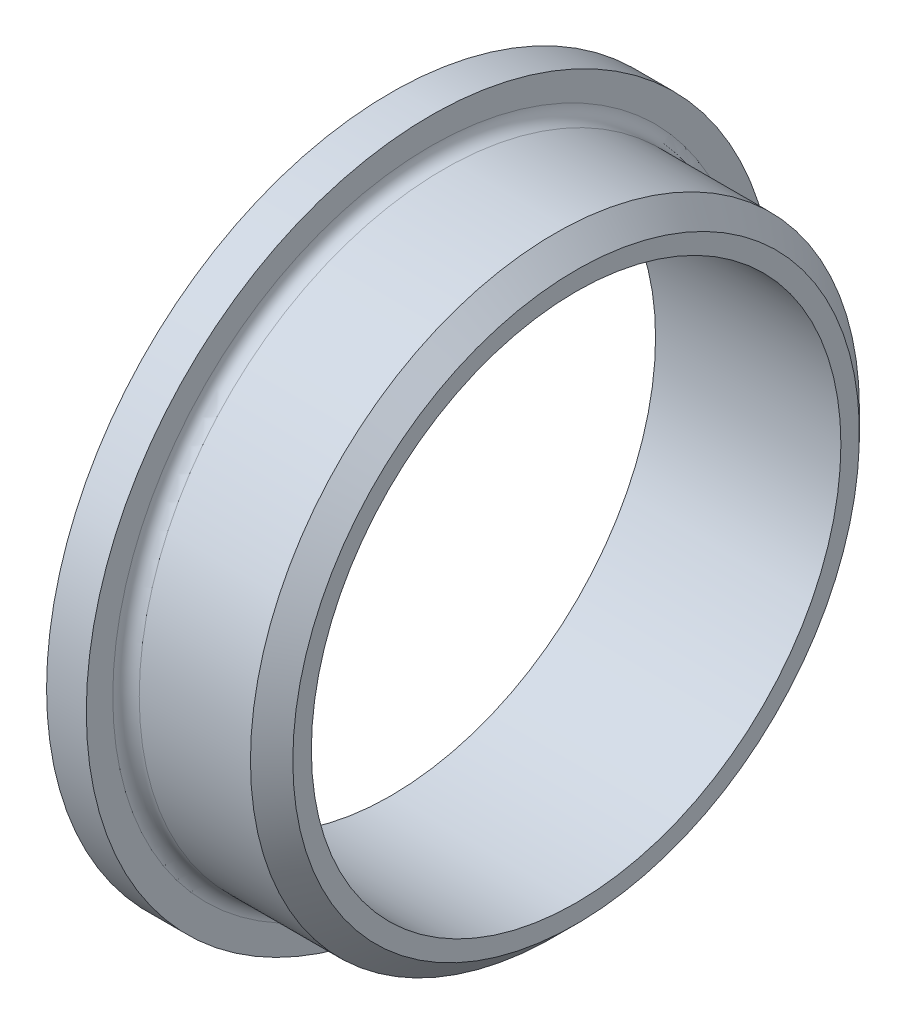
ISO-10303-21;
HEADER;
FILE_DESCRIPTION(('STEP AP214'),'2;1');
FILE_NAME('part.step','',(''),(''),'','','');
FILE_SCHEMA(('AUTOMOTIVE_DESIGN { 1 0 10303 214 1 1 1 1 }'));
ENDSEC;
DATA;
#1=APPLICATION_CONTEXT('core data for automotive mechanical design processes');
#2=APPLICATION_PROTOCOL_DEFINITION('international standard','automotive_design',2000,#1);
#3=PRODUCT_CONTEXT('',#1,'mechanical');
#4=PRODUCT('Part','Part','',(#3));
#5=PRODUCT_RELATED_PRODUCT_CATEGORY('part','',(#4));
#6=PRODUCT_DEFINITION_FORMATION('','',#4);
#7=PRODUCT_DEFINITION_CONTEXT('part definition',#1,'design');
#8=PRODUCT_DEFINITION('design','',#6,#7);
#9=PRODUCT_DEFINITION_SHAPE('','',#8);
#10=(LENGTH_UNIT() NAMED_UNIT(*) SI_UNIT(.MILLI.,.METRE.));
#11=(NAMED_UNIT(*) PLANE_ANGLE_UNIT() SI_UNIT($,.RADIAN.));
#12=(NAMED_UNIT(*) SI_UNIT($,.STERADIAN.) SOLID_ANGLE_UNIT());
#13=UNCERTAINTY_MEASURE_WITH_UNIT(LENGTH_MEASURE(1.E-05),#10,'distance_accuracy_value','');
#14=(GEOMETRIC_REPRESENTATION_CONTEXT(3) GLOBAL_UNCERTAINTY_ASSIGNED_CONTEXT((#13)) GLOBAL_UNIT_ASSIGNED_CONTEXT((#10,
#11,#12)) REPRESENTATION_CONTEXT('',''));
#15=CARTESIAN_POINT('',(0.,0.,0.));
#16=DIRECTION('',(0.,0.,1.));
#17=DIRECTION('',(1.,0.,0.));
#18=AXIS2_PLACEMENT_3D('',#15,#16,#17);
#19=CARTESIAN_POINT('',(7.,11.5,0.));
#20=DIRECTION('',(-1.,0.,0.));
#21=DIRECTION('',(0.,0.,1.));
#22=AXIS2_PLACEMENT_3D('',#19,#20,#21);
#23=PLANE('',#22);
#24=CARTESIAN_POINT('',(7.,0.,0.));
#25=DIRECTION('',(-1.,0.,0.));
#26=DIRECTION('',(0.,0.,1.));
#27=AXIS2_PLACEMENT_3D('',#24,#25,#26);
#28=CIRCLE('',#27,10.7);
#29=CARTESIAN_POINT('',(7.,0.,10.7));
#30=VERTEX_POINT('',#29);
#31=EDGE_CURVE('E10',#30,#30,#28,.F.);
#32=ORIENTED_EDGE('',*,*,#31,.T.);
#33=EDGE_LOOP('',(#32));
#34=FACE_BOUND('',#33,.T.);
#35=CARTESIAN_POINT('',(7.,0.,0.));
#36=DIRECTION('',(-1.,0.,0.));
#37=DIRECTION('',(0.,0.,1.));
#38=AXIS2_PLACEMENT_3D('',#35,#36,#37);
#39=CIRCLE('',#38,10.);
#40=CARTESIAN_POINT('',(7.,0.,10.));
#41=VERTEX_POINT('',#40);
#42=EDGE_CURVE('E70',#41,#41,#39,.T.);
#43=ORIENTED_EDGE('',*,*,#42,.T.);
#44=EDGE_LOOP('',(#43));
#45=FACE_BOUND('',#44,.T.);
#46=ADVANCED_FACE('F45',(#34,#45),#23,.F.);
#47=CARTESIAN_POINT('',(0.,0.,0.));
#48=DIRECTION('',(-1.,0.,0.));
#49=DIRECTION('',(0.,0.,1.));
#50=AXIS2_PLACEMENT_3D('',#47,#48,#49);
#51=CYLINDRICAL_SURFACE('',#50,10.);
#52=ORIENTED_EDGE('',*,*,#42,.F.);
#53=EDGE_LOOP('',(#52));
#54=FACE_BOUND('',#53,.T.);
#55=CARTESIAN_POINT('',(0.,0.,0.));
#56=DIRECTION('',(-1.,0.,0.));
#57=DIRECTION('',(0.,0.,1.));
#58=AXIS2_PLACEMENT_3D('',#55,#56,#57);
#59=CIRCLE('',#58,10.);
#60=CARTESIAN_POINT('',(0.,0.,10.));
#61=VERTEX_POINT('',#60);
#62=EDGE_CURVE('E74',#61,#61,#59,.T.);
#63=ORIENTED_EDGE('',*,*,#62,.T.);
#64=EDGE_LOOP('',(#63));
#65=FACE_BOUND('',#64,.T.);
#66=ADVANCED_FACE('F105',(#54,#65),#51,.F.);
#67=CARTESIAN_POINT('',(0.,10.,0.));
#68=DIRECTION('',(1.,0.,0.));
#69=DIRECTION('',(0.,0.,-1.));
#70=AXIS2_PLACEMENT_3D('',#67,#68,#69);
#71=PLANE('',#70);
#72=ORIENTED_EDGE('',*,*,#62,.F.);
#73=EDGE_LOOP('',(#72));
#74=FACE_BOUND('',#73,.T.);
#75=CARTESIAN_POINT('',(0.,0.,0.));
#76=DIRECTION('',(-1.,0.,0.));
#77=DIRECTION('',(0.,0.,1.));
#78=AXIS2_PLACEMENT_3D('',#75,#76,#77);
#79=CIRCLE('',#78,13.);
#80=CARTESIAN_POINT('',(0.,0.,13.));
#81=VERTEX_POINT('',#80);
#82=EDGE_CURVE('E78',#81,#81,#79,.T.);
#83=ORIENTED_EDGE('',*,*,#82,.T.);
#84=EDGE_LOOP('',(#83));
#85=FACE_BOUND('',#84,.T.);
#86=ADVANCED_FACE('F101',(#74,#85),#71,.F.);
#87=CARTESIAN_POINT('',(0.,0.,0.));
#88=DIRECTION('',(-1.,0.,0.));
#89=DIRECTION('',(0.,0.,1.));
#90=AXIS2_PLACEMENT_3D('',#87,#88,#89);
#91=CYLINDRICAL_SURFACE('',#90,13.);
#92=ORIENTED_EDGE('',*,*,#82,.F.);
#93=EDGE_LOOP('',(#92));
#94=FACE_BOUND('',#93,.T.);
#95=CARTESIAN_POINT('',(1.5,0.,0.));
#96=DIRECTION('',(-1.,0.,0.));
#97=DIRECTION('',(0.,0.,1.));
#98=AXIS2_PLACEMENT_3D('',#95,#96,#97);
#99=CIRCLE('',#98,13.);
#100=CARTESIAN_POINT('',(1.5,0.,13.));
#101=VERTEX_POINT('',#100);
#102=EDGE_CURVE('E82',#101,#101,#99,.T.);
#103=ORIENTED_EDGE('',*,*,#102,.T.);
#104=EDGE_LOOP('',(#103));
#105=FACE_BOUND('',#104,.T.);
#106=ADVANCED_FACE('F87',(#94,#105),#91,.T.);
#107=CARTESIAN_POINT('',(1.5,13.,0.));
#108=DIRECTION('',(-1.,0.,0.));
#109=DIRECTION('',(0.,0.,1.));
#110=AXIS2_PLACEMENT_3D('',#107,#108,#109);
#111=PLANE('',#110);
#112=CARTESIAN_POINT('',(1.5,0.,0.));
#113=DIRECTION('',(-1.,0.,0.));
#114=DIRECTION('',(0.,0.,1.));
#115=AXIS2_PLACEMENT_3D('',#112,#113,#114);
#116=CIRCLE('',#115,12.);
#117=CARTESIAN_POINT('',(1.5,0.,12.));
#118=VERTEX_POINT('',#117);
#119=EDGE_CURVE('E64',#118,#118,#116,.T.);
#120=ORIENTED_EDGE('',*,*,#119,.T.);
#121=EDGE_LOOP('',(#120));
#122=FACE_BOUND('',#121,.T.);
#123=ORIENTED_EDGE('',*,*,#102,.F.);
#124=EDGE_LOOP('',(#123));
#125=FACE_BOUND('',#124,.T.);
#126=ADVANCED_FACE('F89',(#122,#125),#111,.F.);
#127=CARTESIAN_POINT('',(0.,0.,0.));
#128=DIRECTION('',(-1.,0.,0.));
#129=DIRECTION('',(0.,0.,1.));
#130=AXIS2_PLACEMENT_3D('',#127,#128,#129);
#131=CYLINDRICAL_SURFACE('',#130,11.5);
#132=CARTESIAN_POINT('',(6.2,0.,0.));
#133=DIRECTION('',(-1.,0.,0.));
#134=DIRECTION('',(0.,0.,1.));
#135=AXIS2_PLACEMENT_3D('',#132,#133,#134);
#136=CIRCLE('',#135,11.5);
#137=CARTESIAN_POINT('',(6.2,0.,11.5));
#138=VERTEX_POINT('',#137);
#139=EDGE_CURVE('E54',#138,#138,#136,.T.);
#140=ORIENTED_EDGE('',*,*,#139,.T.);
#141=EDGE_LOOP('',(#140));
#142=FACE_BOUND('',#141,.T.);
#143=CARTESIAN_POINT('',(2.,0.,0.));
#144=DIRECTION('',(-1.,0.,0.));
#145=DIRECTION('',(0.,0.,1.));
#146=AXIS2_PLACEMENT_3D('',#143,#144,#145);
#147=CIRCLE('',#146,11.5);
#148=CARTESIAN_POINT('',(2.,0.,11.5));
#149=VERTEX_POINT('',#148);
#150=EDGE_CURVE('E59',#149,#149,#147,.F.);
#151=ORIENTED_EDGE('',*,*,#150,.T.);
#152=EDGE_LOOP('',(#151));
#153=FACE_BOUND('',#152,.T.);
#154=ADVANCED_FACE('F91',(#142,#153),#131,.T.);
#155=CARTESIAN_POINT('',(2.,0.,0.));
#156=DIRECTION('',(-1.,0.,0.));
#157=DIRECTION('',(0.,0.,1.));
#158=AXIS2_PLACEMENT_3D('',#155,#156,#157);
#159=TOROIDAL_SURFACE('',#158,12.,0.5);
#160=ORIENTED_EDGE('',*,*,#150,.F.);
#161=EDGE_LOOP('',(#160));
#162=FACE_BOUND('',#161,.T.);
#163=ORIENTED_EDGE('',*,*,#119,.F.);
#164=EDGE_LOOP('',(#163));
#165=FACE_BOUND('',#164,.T.);
#166=ADVANCED_FACE('F99',(#162,#165),#159,.F.);
#167=CARTESIAN_POINT('',(6.2,0.,0.));
#168=DIRECTION('',(-1.,0.,0.));
#169=DIRECTION('',(0.,0.,1.));
#170=AXIS2_PLACEMENT_3D('',#167,#168,#169);
#171=CONICAL_SURFACE('',#170,11.5,0.785398163397449);
#172=ORIENTED_EDGE('',*,*,#31,.F.);
#173=EDGE_LOOP('',(#172));
#174=FACE_BOUND('',#173,.T.);
#175=ORIENTED_EDGE('',*,*,#139,.F.);
#176=EDGE_LOOP('',(#175));
#177=FACE_BOUND('',#176,.T.);
#178=ADVANCED_FACE('F48',(#174,#177),#171,.T.);
#179=CLOSED_SHELL('',(#46,#66,#86,#106,#126,#154,#166,#178));
#180=MANIFOLD_SOLID_BREP('B2',#179);
#181=ADVANCED_BREP_SHAPE_REPRESENTATION('',(#18,#180),#14);
#182=SHAPE_DEFINITION_REPRESENTATION(#9,#181);
ENDSEC;
END-ISO-10303-21;
